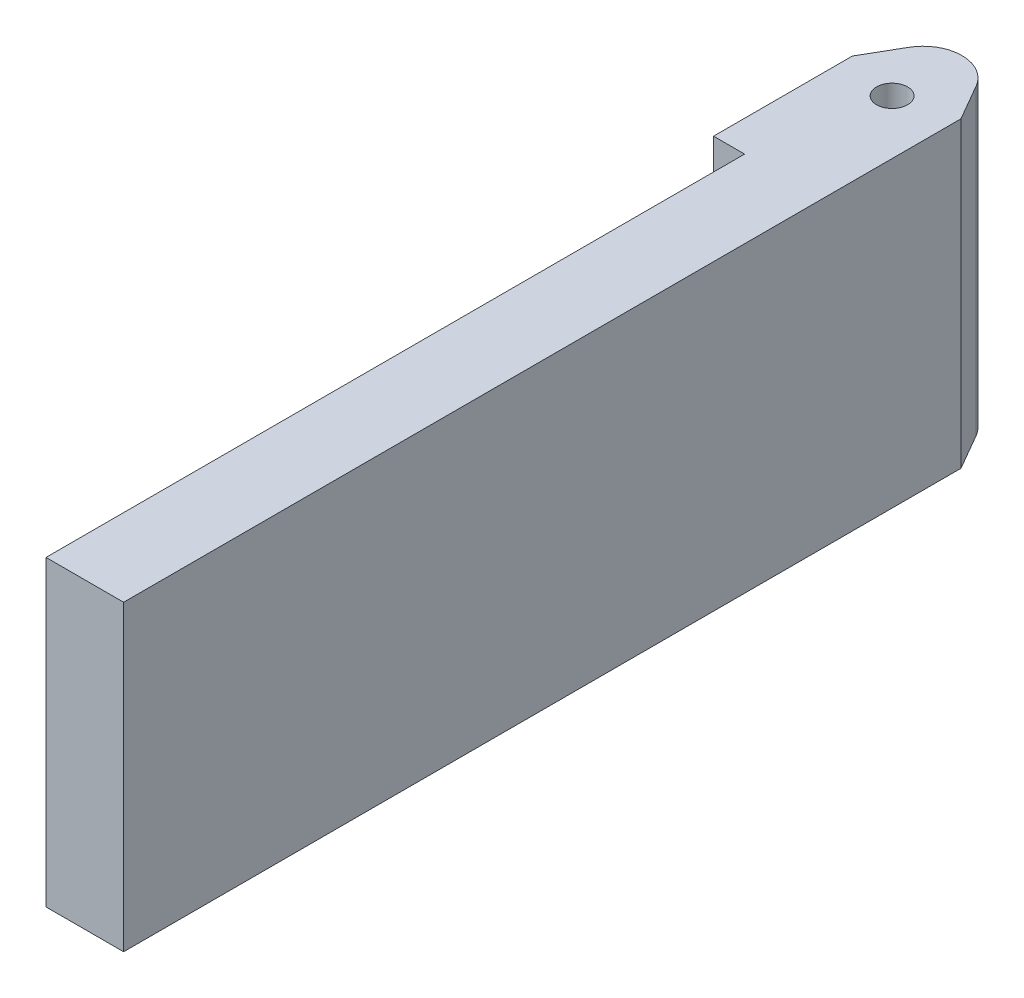
ISO-10303-21;
HEADER;
FILE_DESCRIPTION(('STEP AP214'),'2;1');
FILE_NAME('part.step','',(''),(''),'','','');
FILE_SCHEMA(('AUTOMOTIVE_DESIGN { 1 0 10303 214 1 1 1 1 }'));
ENDSEC;
DATA;
#1=APPLICATION_CONTEXT('core data for automotive mechanical design processes');
#2=APPLICATION_PROTOCOL_DEFINITION('international standard','automotive_design',2000,#1);
#3=PRODUCT_CONTEXT('',#1,'mechanical');
#4=PRODUCT('Part','Part','',(#3));
#5=PRODUCT_RELATED_PRODUCT_CATEGORY('part','',(#4));
#6=PRODUCT_DEFINITION_FORMATION('','',#4);
#7=PRODUCT_DEFINITION_CONTEXT('part definition',#1,'design');
#8=PRODUCT_DEFINITION('design','',#6,#7);
#9=PRODUCT_DEFINITION_SHAPE('','',#8);
#10=(LENGTH_UNIT() NAMED_UNIT(*) SI_UNIT(.MILLI.,.METRE.));
#11=(NAMED_UNIT(*) PLANE_ANGLE_UNIT() SI_UNIT($,.RADIAN.));
#12=(NAMED_UNIT(*) SI_UNIT($,.STERADIAN.) SOLID_ANGLE_UNIT());
#13=UNCERTAINTY_MEASURE_WITH_UNIT(LENGTH_MEASURE(1.E-05),#10,'distance_accuracy_value','');
#14=(GEOMETRIC_REPRESENTATION_CONTEXT(3) GLOBAL_UNCERTAINTY_ASSIGNED_CONTEXT((#13)) GLOBAL_UNIT_ASSIGNED_CONTEXT((#10,
#11,#12)) REPRESENTATION_CONTEXT('',''));
#15=CARTESIAN_POINT('',(0.,0.,0.));
#16=DIRECTION('',(0.,0.,1.));
#17=DIRECTION('',(1.,0.,0.));
#18=AXIS2_PLACEMENT_3D('',#15,#16,#17);
#19=CARTESIAN_POINT('',(0.,0.,-50.));
#20=DIRECTION('',(0.,-1.,0.));
#21=DIRECTION('',(0.,0.,-1.));
#22=AXIS2_PLACEMENT_3D('',#19,#20,#21);
#23=CYLINDRICAL_SURFACE('',#22,5.);
#24=DIRECTION('',(0.,-1.,0.));
#25=VECTOR('',#24,1.);
#26=CARTESIAN_POINT('',(-4.3301270189222,0.,-52.5));
#27=LINE('',#26,#25);
#28=CARTESIAN_POINT('',(-4.3301270189222,39.,-52.5));
#29=VERTEX_POINT('',#28);
#30=CARTESIAN_POINT('',(-4.3301270189222,0.,-52.5));
#31=VERTEX_POINT('',#30);
#32=EDGE_CURVE('E124',#29,#31,#27,.T.);
#33=ORIENTED_EDGE('',*,*,#32,.F.);
#34=CARTESIAN_POINT('',(0.,39.,-50.));
#35=DIRECTION('',(0.,-1.,0.));
#36=DIRECTION('',(0.,0.,-1.));
#37=AXIS2_PLACEMENT_3D('',#34,#35,#36);
#38=CIRCLE('',#37,5.);
#39=CARTESIAN_POINT('',(4.33012701892221,39.,-52.5));
#40=VERTEX_POINT('',#39);
#41=EDGE_CURVE('E43',#40,#29,#38,.F.);
#42=ORIENTED_EDGE('',*,*,#41,.F.);
#43=DIRECTION('',(0.,-1.,0.));
#44=VECTOR('',#43,1.);
#45=CARTESIAN_POINT('',(4.33012701892221,0.,-52.5));
#46=LINE('',#45,#44);
#47=CARTESIAN_POINT('',(4.33012701892221,0.,-52.5));
#48=VERTEX_POINT('',#47);
#49=EDGE_CURVE('E133',#48,#40,#46,.F.);
#50=ORIENTED_EDGE('',*,*,#49,.F.);
#51=CARTESIAN_POINT('',(0.,0.,-50.));
#52=DIRECTION('',(0.,-1.,0.));
#53=DIRECTION('',(0.,0.,-1.));
#54=AXIS2_PLACEMENT_3D('',#51,#52,#53);
#55=CIRCLE('',#54,5.);
#56=EDGE_CURVE('E12',#31,#48,#55,.T.);
#57=ORIENTED_EDGE('',*,*,#56,.F.);
#58=EDGE_LOOP('',(#33,#42,#50,#57));
#59=FACE_BOUND('',#58,.T.);
#60=ADVANCED_FACE('F36',(#59),#23,.T.);
#61=CARTESIAN_POINT('',(0.,39.,0.));
#62=DIRECTION('',(0.,-1.,0.));
#63=DIRECTION('',(0.,0.,-1.));
#64=AXIS2_PLACEMENT_3D('',#61,#62,#63);
#65=PLANE('',#64);
#66=CARTESIAN_POINT('',(0.,39.,-46.));
#67=DIRECTION('',(0.,1.,0.));
#68=DIRECTION('',(0.,0.,1.));
#69=AXIS2_PLACEMENT_3D('',#66,#67,#68);
#70=CIRCLE('',#69,2.);
#71=CARTESIAN_POINT('',(0.,39.,-44.));
#72=VERTEX_POINT('',#71);
#73=EDGE_CURVE('E178',#72,#72,#70,.T.);
#74=ORIENTED_EDGE('',*,*,#73,.F.);
#75=EDGE_LOOP('',(#74));
#76=FACE_BOUND('',#75,.T.);
#77=DIRECTION('',(0.,0.,-1.));
#78=VECTOR('',#77,1.);
#79=CARTESIAN_POINT('',(-6.99999999999999,39.,60.));
#80=LINE('',#79,#78);
#81=CARTESIAN_POINT('',(-6.99999999999999,39.,-30.));
#82=VERTEX_POINT('',#81);
#83=CARTESIAN_POINT('',(-6.99999999999998,39.,-47.8756443470178));
#84=VERTEX_POINT('',#83);
#85=EDGE_CURVE('E159',#82,#84,#80,.T.);
#86=ORIENTED_EDGE('',*,*,#85,.F.);
#87=DIRECTION('',(-1.,0.,0.));
#88=VECTOR('',#87,1.);
#89=CARTESIAN_POINT('',(-6.99999999999999,39.,-30.));
#90=LINE('',#89,#88);
#91=CARTESIAN_POINT('',(-2.99999999999999,39.,-30.));
#92=VERTEX_POINT('',#91);
#93=EDGE_CURVE('E50',#92,#82,#90,.T.);
#94=ORIENTED_EDGE('',*,*,#93,.F.);
#95=DIRECTION('',(0.,0.,-1.));
#96=VECTOR('',#95,1.);
#97=CARTESIAN_POINT('',(-2.99999999999999,39.,-30.));
#98=LINE('',#97,#96);
#99=CARTESIAN_POINT('',(-2.99999999999998,39.,60.));
#100=VERTEX_POINT('',#99);
#101=EDGE_CURVE('E174',#100,#92,#98,.T.);
#102=ORIENTED_EDGE('',*,*,#101,.F.);
#103=DIRECTION('',(1.,0.,0.));
#104=VECTOR('',#103,1.);
#105=CARTESIAN_POINT('',(-15.,39.,60.));
#106=LINE('',#105,#104);
#107=CARTESIAN_POINT('',(7.,39.,60.));
#108=VERTEX_POINT('',#107);
#109=EDGE_CURVE('E118',#100,#108,#106,.T.);
#110=ORIENTED_EDGE('',*,*,#109,.T.);
#111=DIRECTION('',(0.,0.,1.));
#112=VECTOR('',#111,1.);
#113=CARTESIAN_POINT('',(6.99999999999999,39.,-47.8756443470177));
#114=LINE('',#113,#112);
#115=CARTESIAN_POINT('',(6.99999999999999,39.,-47.8756443470177));
#116=VERTEX_POINT('',#115);
#117=EDGE_CURVE('E166',#116,#108,#114,.T.);
#118=ORIENTED_EDGE('',*,*,#117,.F.);
#119=DIRECTION('',(-0.499999999999998,0.,-0.86602540378444));
#120=VECTOR('',#119,1.);
#121=CARTESIAN_POINT('',(15.,39.,-34.0192378864667));
#122=LINE('',#121,#120);
#123=EDGE_CURVE('E145',#116,#40,#122,.T.);
#124=ORIENTED_EDGE('',*,*,#123,.T.);
#125=ORIENTED_EDGE('',*,*,#41,.T.);
#126=DIRECTION('',(-0.499999999999998,0.,0.86602540378444));
#127=VECTOR('',#126,1.);
#128=CARTESIAN_POINT('',(0.,39.,-60.));
#129=LINE('',#128,#127);
#130=EDGE_CURVE('E142',#29,#84,#129,.T.);
#131=ORIENTED_EDGE('',*,*,#130,.T.);
#132=EDGE_LOOP('',(#86,#94,#102,#110,#118,#124,#125,#131));
#133=FACE_BOUND('',#132,.T.);
#134=ADVANCED_FACE('F140',(#76,#133),#65,.F.);
#135=CARTESIAN_POINT('',(0.,0.,0.));
#136=DIRECTION('',(0.,-1.,0.));
#137=DIRECTION('',(0.,0.,-1.));
#138=AXIS2_PLACEMENT_3D('',#135,#136,#137);
#139=PLANE('',#138);
#140=CARTESIAN_POINT('',(0.,0.,-46.));
#141=DIRECTION('',(0.,1.,0.));
#142=DIRECTION('',(0.,0.,1.));
#143=AXIS2_PLACEMENT_3D('',#140,#141,#142);
#144=CIRCLE('',#143,2.);
#145=CARTESIAN_POINT('',(0.,0.,-44.));
#146=VERTEX_POINT('',#145);
#147=EDGE_CURVE('E176',#146,#146,#144,.T.);
#148=ORIENTED_EDGE('',*,*,#147,.T.);
#149=EDGE_LOOP('',(#148));
#150=FACE_BOUND('',#149,.T.);
#151=DIRECTION('',(-1.,0.,0.));
#152=VECTOR('',#151,1.);
#153=CARTESIAN_POINT('',(-6.99999999999999,0.,-30.));
#154=LINE('',#153,#152);
#155=CARTESIAN_POINT('',(-2.99999999999999,0.,-30.));
#156=VERTEX_POINT('',#155);
#157=CARTESIAN_POINT('',(-6.99999999999999,0.,-30.));
#158=VERTEX_POINT('',#157);
#159=EDGE_CURVE('E111',#156,#158,#154,.T.);
#160=ORIENTED_EDGE('',*,*,#159,.T.);
#161=DIRECTION('',(0.,0.,-1.));
#162=VECTOR('',#161,1.);
#163=CARTESIAN_POINT('',(-6.99999999999999,0.,60.));
#164=LINE('',#163,#162);
#165=CARTESIAN_POINT('',(-6.99999999999999,0.,-47.8756443470178));
#166=VERTEX_POINT('',#165);
#167=EDGE_CURVE('E158',#158,#166,#164,.T.);
#168=ORIENTED_EDGE('',*,*,#167,.T.);
#169=DIRECTION('',(-0.499999999999998,0.,0.86602540378444));
#170=VECTOR('',#169,1.);
#171=CARTESIAN_POINT('',(0.,0.,-60.));
#172=LINE('',#171,#170);
#173=EDGE_CURVE('E122',#31,#166,#172,.T.);
#174=ORIENTED_EDGE('',*,*,#173,.F.);
#175=ORIENTED_EDGE('',*,*,#56,.T.);
#176=DIRECTION('',(-0.499999999999998,0.,-0.86602540378444));
#177=VECTOR('',#176,1.);
#178=CARTESIAN_POINT('',(15.,0.,-34.0192378864667));
#179=LINE('',#178,#177);
#180=CARTESIAN_POINT('',(7.00000000000003,0.,-47.8756443470177));
#181=VERTEX_POINT('',#180);
#182=EDGE_CURVE('E127',#181,#48,#179,.T.);
#183=ORIENTED_EDGE('',*,*,#182,.F.);
#184=DIRECTION('',(0.,0.,1.));
#185=VECTOR('',#184,1.);
#186=CARTESIAN_POINT('',(6.99999999999999,0.,-47.8756443470177));
#187=LINE('',#186,#185);
#188=CARTESIAN_POINT('',(7.,0.,60.));
#189=VERTEX_POINT('',#188);
#190=EDGE_CURVE('E58',#181,#189,#187,.T.);
#191=ORIENTED_EDGE('',*,*,#190,.T.);
#192=DIRECTION('',(1.,0.,0.));
#193=VECTOR('',#192,1.);
#194=CARTESIAN_POINT('',(-15.,0.,60.));
#195=LINE('',#194,#193);
#196=CARTESIAN_POINT('',(-2.99999999999998,0.,60.));
#197=VERTEX_POINT('',#196);
#198=EDGE_CURVE('E117',#197,#189,#195,.T.);
#199=ORIENTED_EDGE('',*,*,#198,.F.);
#200=DIRECTION('',(0.,0.,-1.));
#201=VECTOR('',#200,1.);
#202=CARTESIAN_POINT('',(-2.99999999999999,0.,-30.));
#203=LINE('',#202,#201);
#204=EDGE_CURVE('E100',#197,#156,#203,.T.);
#205=ORIENTED_EDGE('',*,*,#204,.T.);
#206=EDGE_LOOP('',(#160,#168,#174,#175,#183,#191,#199,#205));
#207=FACE_BOUND('',#206,.T.);
#208=ADVANCED_FACE('F120',(#150,#207),#139,.T.);
#209=CARTESIAN_POINT('',(-15.,39.,60.));
#210=DIRECTION('',(0.,0.,-1.));
#211=DIRECTION('',(-1.,0.,0.));
#212=AXIS2_PLACEMENT_3D('',#209,#210,#211);
#213=PLANE('',#212);
#214=ORIENTED_EDGE('',*,*,#109,.F.);
#215=DIRECTION('',(0.,1.,0.));
#216=VECTOR('',#215,1.);
#217=CARTESIAN_POINT('',(-2.99999999999998,0.,60.));
#218=LINE('',#217,#216);
#219=EDGE_CURVE('E104',#197,#100,#218,.T.);
#220=ORIENTED_EDGE('',*,*,#219,.F.);
#221=ORIENTED_EDGE('',*,*,#198,.T.);
#222=DIRECTION('',(0.,1.,0.));
#223=VECTOR('',#222,1.);
#224=CARTESIAN_POINT('',(7.,0.,60.));
#225=LINE('',#224,#223);
#226=EDGE_CURVE('E161',#189,#108,#225,.T.);
#227=ORIENTED_EDGE('',*,*,#226,.T.);
#228=EDGE_LOOP('',(#214,#220,#221,#227));
#229=FACE_BOUND('',#228,.T.);
#230=ADVANCED_FACE('F115',(#229),#213,.F.);
#231=CARTESIAN_POINT('',(15.,0.,-34.0192378864667));
#232=DIRECTION('',(0.86602540378444,0.,-0.499999999999998));
#233=DIRECTION('',(-0.499999999999998,0.,-0.86602540378444));
#234=AXIS2_PLACEMENT_3D('',#231,#232,#233);
#235=PLANE('',#234);
#236=DIRECTION('',(0.,1.,0.));
#237=VECTOR('',#236,1.);
#238=CARTESIAN_POINT('',(6.99999999999999,0.,-47.8756443470177));
#239=LINE('',#238,#237);
#240=EDGE_CURVE('E163',#181,#116,#239,.T.);
#241=ORIENTED_EDGE('',*,*,#240,.F.);
#242=ORIENTED_EDGE('',*,*,#182,.T.);
#243=ORIENTED_EDGE('',*,*,#49,.T.);
#244=ORIENTED_EDGE('',*,*,#123,.F.);
#245=EDGE_LOOP('',(#241,#242,#243,#244));
#246=FACE_BOUND('',#245,.T.);
#247=ADVANCED_FACE('F200',(#246),#235,.T.);
#248=CARTESIAN_POINT('',(0.,0.,-60.));
#249=DIRECTION('',(-0.86602540378444,0.,-0.499999999999998));
#250=DIRECTION('',(-0.499999999999998,0.,0.86602540378444));
#251=AXIS2_PLACEMENT_3D('',#248,#249,#250);
#252=PLANE('',#251);
#253=DIRECTION('',(0.,1.,0.));
#254=VECTOR('',#253,1.);
#255=CARTESIAN_POINT('',(-6.99999999999999,0.,-47.8756443470178));
#256=LINE('',#255,#254);
#257=EDGE_CURVE('E153',#166,#84,#256,.T.);
#258=ORIENTED_EDGE('',*,*,#257,.T.);
#259=ORIENTED_EDGE('',*,*,#130,.F.);
#260=ORIENTED_EDGE('',*,*,#32,.T.);
#261=ORIENTED_EDGE('',*,*,#173,.T.);
#262=EDGE_LOOP('',(#258,#259,#260,#261));
#263=FACE_BOUND('',#262,.T.);
#264=ADVANCED_FACE('F151',(#263),#252,.T.);
#265=CARTESIAN_POINT('',(-6.99999999999999,0.,60.));
#266=DIRECTION('',(1.,0.,0.));
#267=DIRECTION('',(0.,0.,-1.));
#268=AXIS2_PLACEMENT_3D('',#265,#266,#267);
#269=PLANE('',#268);
#270=ORIENTED_EDGE('',*,*,#167,.F.);
#271=DIRECTION('',(0.,1.,0.));
#272=VECTOR('',#271,1.);
#273=CARTESIAN_POINT('',(-6.99999999999999,0.,-30.));
#274=LINE('',#273,#272);
#275=EDGE_CURVE('E169',#158,#82,#274,.T.);
#276=ORIENTED_EDGE('',*,*,#275,.T.);
#277=ORIENTED_EDGE('',*,*,#85,.T.);
#278=ORIENTED_EDGE('',*,*,#257,.F.);
#279=EDGE_LOOP('',(#270,#276,#277,#278));
#280=FACE_BOUND('',#279,.T.);
#281=ADVANCED_FACE('F211',(#280),#269,.F.);
#282=CARTESIAN_POINT('',(6.99999999999999,0.,-47.8756443470177));
#283=DIRECTION('',(-1.,0.,0.));
#284=DIRECTION('',(0.,0.,1.));
#285=AXIS2_PLACEMENT_3D('',#282,#283,#284);
#286=PLANE('',#285);
#287=ORIENTED_EDGE('',*,*,#117,.T.);
#288=ORIENTED_EDGE('',*,*,#226,.F.);
#289=ORIENTED_EDGE('',*,*,#190,.F.);
#290=ORIENTED_EDGE('',*,*,#240,.T.);
#291=EDGE_LOOP('',(#287,#288,#289,#290));
#292=FACE_BOUND('',#291,.T.);
#293=ADVANCED_FACE('F214',(#292),#286,.F.);
#294=CARTESIAN_POINT('',(-6.99999999999999,0.,-30.));
#295=DIRECTION('',(0.,0.,-1.));
#296=DIRECTION('',(-1.,0.,0.));
#297=AXIS2_PLACEMENT_3D('',#294,#295,#296);
#298=PLANE('',#297);
#299=ORIENTED_EDGE('',*,*,#93,.T.);
#300=ORIENTED_EDGE('',*,*,#275,.F.);
#301=ORIENTED_EDGE('',*,*,#159,.F.);
#302=DIRECTION('',(0.,1.,0.));
#303=VECTOR('',#302,1.);
#304=CARTESIAN_POINT('',(-2.99999999999999,0.,-30.));
#305=LINE('',#304,#303);
#306=EDGE_CURVE('E106',#156,#92,#305,.T.);
#307=ORIENTED_EDGE('',*,*,#306,.T.);
#308=EDGE_LOOP('',(#299,#300,#301,#307));
#309=FACE_BOUND('',#308,.T.);
#310=ADVANCED_FACE('F216',(#309),#298,.F.);
#311=CARTESIAN_POINT('',(-2.99999999999999,0.,-30.));
#312=DIRECTION('',(1.,0.,0.));
#313=DIRECTION('',(0.,0.,-1.));
#314=AXIS2_PLACEMENT_3D('',#311,#312,#313);
#315=PLANE('',#314);
#316=ORIENTED_EDGE('',*,*,#101,.T.);
#317=ORIENTED_EDGE('',*,*,#306,.F.);
#318=ORIENTED_EDGE('',*,*,#204,.F.);
#319=ORIENTED_EDGE('',*,*,#219,.T.);
#320=EDGE_LOOP('',(#316,#317,#318,#319));
#321=FACE_BOUND('',#320,.T.);
#322=ADVANCED_FACE('F103',(#321),#315,.F.);
#323=CARTESIAN_POINT('',(0.,0.,-46.));
#324=DIRECTION('',(0.,1.,0.));
#325=DIRECTION('',(0.,0.,1.));
#326=AXIS2_PLACEMENT_3D('',#323,#324,#325);
#327=CYLINDRICAL_SURFACE('',#326,2.);
#328=ORIENTED_EDGE('',*,*,#147,.F.);
#329=EDGE_LOOP('',(#328));
#330=FACE_BOUND('',#329,.T.);
#331=ORIENTED_EDGE('',*,*,#73,.T.);
#332=EDGE_LOOP('',(#331));
#333=FACE_BOUND('',#332,.T.);
#334=ADVANCED_FACE('F185',(#330,#333),#327,.F.);
#335=CLOSED_SHELL('',(#60,#134,#208,#230,#247,#264,#281,#293,#310,#322,#334));
#336=MANIFOLD_SOLID_BREP('B2',#335);
#337=ADVANCED_BREP_SHAPE_REPRESENTATION('',(#18,#336),#14);
#338=SHAPE_DEFINITION_REPRESENTATION(#9,#337);
ENDSEC;
END-ISO-10303-21;
